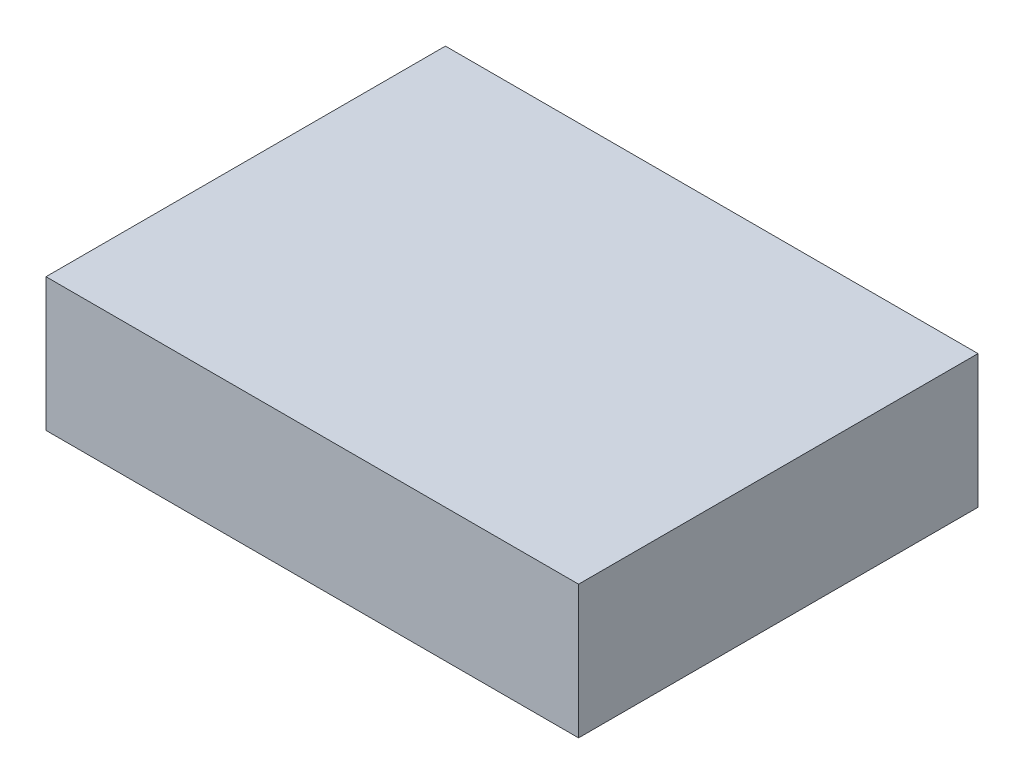
ISO-10303-21;
HEADER;
FILE_DESCRIPTION(('STEP AP214'),'2;1');
FILE_NAME('part.step','',(''),(''),'','','');
FILE_SCHEMA(('AUTOMOTIVE_DESIGN { 1 0 10303 214 1 1 1 1 }'));
ENDSEC;
DATA;
#1=APPLICATION_CONTEXT('core data for automotive mechanical design processes');
#2=APPLICATION_PROTOCOL_DEFINITION('international standard','automotive_design',2000,#1);
#3=PRODUCT_CONTEXT('',#1,'mechanical');
#4=PRODUCT('Part','Part','',(#3));
#5=PRODUCT_RELATED_PRODUCT_CATEGORY('part','',(#4));
#6=PRODUCT_DEFINITION_FORMATION('','',#4);
#7=PRODUCT_DEFINITION_CONTEXT('part definition',#1,'design');
#8=PRODUCT_DEFINITION('design','',#6,#7);
#9=PRODUCT_DEFINITION_SHAPE('','',#8);
#10=(LENGTH_UNIT() NAMED_UNIT(*) SI_UNIT(.MILLI.,.METRE.));
#11=(NAMED_UNIT(*) PLANE_ANGLE_UNIT() SI_UNIT($,.RADIAN.));
#12=(NAMED_UNIT(*) SI_UNIT($,.STERADIAN.) SOLID_ANGLE_UNIT());
#13=UNCERTAINTY_MEASURE_WITH_UNIT(LENGTH_MEASURE(1.E-05),#10,'distance_accuracy_value','');
#14=(GEOMETRIC_REPRESENTATION_CONTEXT(3) GLOBAL_UNCERTAINTY_ASSIGNED_CONTEXT((#13)) GLOBAL_UNIT_ASSIGNED_CONTEXT((#10,
#11,#12)) REPRESENTATION_CONTEXT('',''));
#15=CARTESIAN_POINT('',(0.,0.,0.));
#16=DIRECTION('',(0.,0.,1.));
#17=DIRECTION('',(1.,0.,0.));
#18=AXIS2_PLACEMENT_3D('',#15,#16,#17);
#19=CARTESIAN_POINT('',(0.,12.7,0.));
#20=DIRECTION('',(1.,0.,0.));
#21=DIRECTION('',(0.,0.,-1.));
#22=AXIS2_PLACEMENT_3D('',#19,#20,#21);
#23=PLANE('',#22);
#24=DIRECTION('',(0.,0.,1.));
#25=VECTOR('',#24,1.);
#26=CARTESIAN_POINT('',(0.,0.,0.));
#27=LINE('',#26,#25);
#28=CARTESIAN_POINT('',(0.,0.,-38.1));
#29=VERTEX_POINT('',#28);
#30=CARTESIAN_POINT('',(0.,0.,0.));
#31=VERTEX_POINT('',#30);
#32=EDGE_CURVE('E97',#29,#31,#27,.T.);
#33=ORIENTED_EDGE('',*,*,#32,.T.);
#34=DIRECTION('',(0.,-1.,0.));
#35=VECTOR('',#34,1.);
#36=CARTESIAN_POINT('',(0.,12.7,0.));
#37=LINE('',#36,#35);
#38=CARTESIAN_POINT('',(0.,12.7,0.));
#39=VERTEX_POINT('',#38);
#40=EDGE_CURVE('E11',#39,#31,#37,.T.);
#41=ORIENTED_EDGE('',*,*,#40,.F.);
#42=DIRECTION('',(0.,0.,1.));
#43=VECTOR('',#42,1.);
#44=CARTESIAN_POINT('',(0.,12.7,0.));
#45=LINE('',#44,#43);
#46=CARTESIAN_POINT('',(0.,12.7,-38.1));
#47=VERTEX_POINT('',#46);
#48=EDGE_CURVE('E85',#47,#39,#45,.T.);
#49=ORIENTED_EDGE('',*,*,#48,.F.);
#50=DIRECTION('',(0.,-1.,0.));
#51=VECTOR('',#50,1.);
#52=CARTESIAN_POINT('',(0.,12.7,-38.1));
#53=LINE('',#52,#51);
#54=EDGE_CURVE('E93',#47,#29,#53,.T.);
#55=ORIENTED_EDGE('',*,*,#54,.T.);
#56=EDGE_LOOP('',(#33,#41,#49,#55));
#57=FACE_BOUND('',#56,.T.);
#58=ADVANCED_FACE('F34',(#57),#23,.F.);
#59=CARTESIAN_POINT('',(0.,12.7,0.));
#60=DIRECTION('',(0.,0.,-1.));
#61=DIRECTION('',(-1.,0.,0.));
#62=AXIS2_PLACEMENT_3D('',#59,#60,#61);
#63=PLANE('',#62);
#64=DIRECTION('',(1.,0.,0.));
#65=VECTOR('',#64,1.);
#66=CARTESIAN_POINT('',(0.,0.,0.));
#67=LINE('',#66,#65);
#68=CARTESIAN_POINT('',(50.8,0.,0.));
#69=VERTEX_POINT('',#68);
#70=EDGE_CURVE('E89',#31,#69,#67,.T.);
#71=ORIENTED_EDGE('',*,*,#70,.T.);
#72=DIRECTION('',(0.,-1.,0.));
#73=VECTOR('',#72,1.);
#74=CARTESIAN_POINT('',(50.8,12.7,0.));
#75=LINE('',#74,#73);
#76=CARTESIAN_POINT('',(50.8,12.7,0.));
#77=VERTEX_POINT('',#76);
#78=EDGE_CURVE('E42',#77,#69,#75,.T.);
#79=ORIENTED_EDGE('',*,*,#78,.F.);
#80=DIRECTION('',(1.,0.,0.));
#81=VECTOR('',#80,1.);
#82=CARTESIAN_POINT('',(0.,12.7,0.));
#83=LINE('',#82,#81);
#84=EDGE_CURVE('E80',#39,#77,#83,.T.);
#85=ORIENTED_EDGE('',*,*,#84,.F.);
#86=ORIENTED_EDGE('',*,*,#40,.T.);
#87=EDGE_LOOP('',(#71,#79,#85,#86));
#88=FACE_BOUND('',#87,.T.);
#89=ADVANCED_FACE('F88',(#88),#63,.F.);
#90=CARTESIAN_POINT('',(50.8,12.7,0.));
#91=DIRECTION('',(-1.,0.,0.));
#92=DIRECTION('',(0.,0.,1.));
#93=AXIS2_PLACEMENT_3D('',#90,#91,#92);
#94=PLANE('',#93);
#95=DIRECTION('',(0.,0.,-1.));
#96=VECTOR('',#95,1.);
#97=CARTESIAN_POINT('',(50.8,0.,0.));
#98=LINE('',#97,#96);
#99=CARTESIAN_POINT('',(50.8,0.,-38.1));
#100=VERTEX_POINT('',#99);
#101=EDGE_CURVE('E67',#69,#100,#98,.T.);
#102=ORIENTED_EDGE('',*,*,#101,.T.);
#103=DIRECTION('',(0.,-1.,0.));
#104=VECTOR('',#103,1.);
#105=CARTESIAN_POINT('',(50.8,12.7,-38.1));
#106=LINE('',#105,#104);
#107=CARTESIAN_POINT('',(50.8,12.7,-38.1));
#108=VERTEX_POINT('',#107);
#109=EDGE_CURVE('E90',#108,#100,#106,.T.);
#110=ORIENTED_EDGE('',*,*,#109,.F.);
#111=DIRECTION('',(0.,0.,-1.));
#112=VECTOR('',#111,1.);
#113=CARTESIAN_POINT('',(50.8,12.7,0.));
#114=LINE('',#113,#112);
#115=EDGE_CURVE('E83',#77,#108,#114,.T.);
#116=ORIENTED_EDGE('',*,*,#115,.F.);
#117=ORIENTED_EDGE('',*,*,#78,.T.);
#118=EDGE_LOOP('',(#102,#110,#116,#117));
#119=FACE_BOUND('',#118,.T.);
#120=ADVANCED_FACE('F91',(#119),#94,.F.);
#121=CARTESIAN_POINT('',(0.,12.7,-38.1));
#122=DIRECTION('',(0.,0.,1.));
#123=DIRECTION('',(1.,0.,0.));
#124=AXIS2_PLACEMENT_3D('',#121,#122,#123);
#125=PLANE('',#124);
#126=DIRECTION('',(-1.,0.,0.));
#127=VECTOR('',#126,1.);
#128=CARTESIAN_POINT('',(0.,0.,-38.1));
#129=LINE('',#128,#127);
#130=EDGE_CURVE('E73',#100,#29,#129,.T.);
#131=ORIENTED_EDGE('',*,*,#130,.T.);
#132=ORIENTED_EDGE('',*,*,#54,.F.);
#133=DIRECTION('',(-1.,0.,0.));
#134=VECTOR('',#133,1.);
#135=CARTESIAN_POINT('',(0.,12.7,-38.1));
#136=LINE('',#135,#134);
#137=EDGE_CURVE('E50',#108,#47,#136,.T.);
#138=ORIENTED_EDGE('',*,*,#137,.F.);
#139=ORIENTED_EDGE('',*,*,#109,.T.);
#140=EDGE_LOOP('',(#131,#132,#138,#139));
#141=FACE_BOUND('',#140,.T.);
#142=ADVANCED_FACE('F104',(#141),#125,.F.);
#143=CARTESIAN_POINT('',(0.,12.7,0.));
#144=DIRECTION('',(0.,-1.,0.));
#145=DIRECTION('',(0.,0.,-1.));
#146=AXIS2_PLACEMENT_3D('',#143,#144,#145);
#147=PLANE('',#146);
#148=ORIENTED_EDGE('',*,*,#48,.T.);
#149=ORIENTED_EDGE('',*,*,#84,.T.);
#150=ORIENTED_EDGE('',*,*,#115,.T.);
#151=ORIENTED_EDGE('',*,*,#137,.T.);
#152=EDGE_LOOP('',(#148,#149,#150,#151));
#153=FACE_BOUND('',#152,.T.);
#154=ADVANCED_FACE('F81',(#153),#147,.F.);
#155=CARTESIAN_POINT('',(0.,0.,0.));
#156=DIRECTION('',(0.,-1.,0.));
#157=DIRECTION('',(0.,0.,-1.));
#158=AXIS2_PLACEMENT_3D('',#155,#156,#157);
#159=PLANE('',#158);
#160=ORIENTED_EDGE('',*,*,#32,.F.);
#161=ORIENTED_EDGE('',*,*,#130,.F.);
#162=ORIENTED_EDGE('',*,*,#101,.F.);
#163=ORIENTED_EDGE('',*,*,#70,.F.);
#164=EDGE_LOOP('',(#160,#161,#162,#163));
#165=FACE_BOUND('',#164,.T.);
#166=ADVANCED_FACE('F107',(#165),#159,.T.);
#167=CLOSED_SHELL('',(#58,#89,#120,#142,#154,#166));
#168=MANIFOLD_SOLID_BREP('B2',#167);
#169=ADVANCED_BREP_SHAPE_REPRESENTATION('',(#18,#168),#14);
#170=SHAPE_DEFINITION_REPRESENTATION(#9,#169);
ENDSEC;
END-ISO-10303-21;
